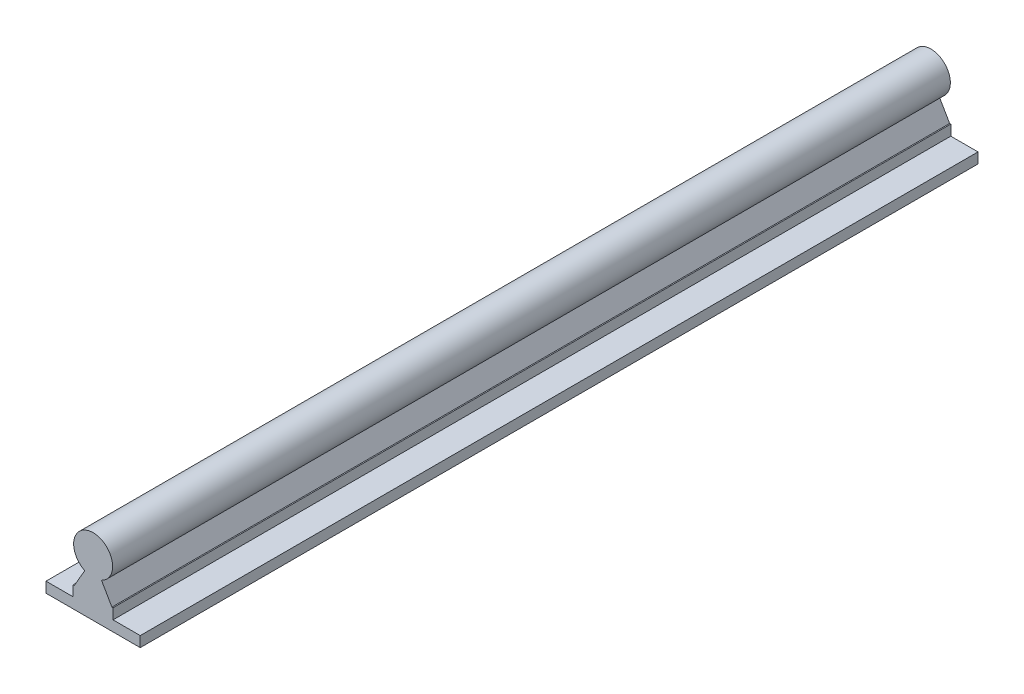
ISO-10303-21;
HEADER;
FILE_DESCRIPTION(('STEP AP214'),'2;1');
FILE_NAME('part.step','',(''),(''),'','','');
FILE_SCHEMA(('AUTOMOTIVE_DESIGN { 1 0 10303 214 1 1 1 1 }'));
ENDSEC;
DATA;
#1=APPLICATION_CONTEXT('core data for automotive mechanical design processes');
#2=APPLICATION_PROTOCOL_DEFINITION('international standard','automotive_design',2000,#1);
#3=PRODUCT_CONTEXT('',#1,'mechanical');
#4=PRODUCT('Part','Part','',(#3));
#5=PRODUCT_RELATED_PRODUCT_CATEGORY('part','',(#4));
#6=PRODUCT_DEFINITION_FORMATION('','',#4);
#7=PRODUCT_DEFINITION_CONTEXT('part definition',#1,'design');
#8=PRODUCT_DEFINITION('design','',#6,#7);
#9=PRODUCT_DEFINITION_SHAPE('','',#8);
#10=(LENGTH_UNIT() NAMED_UNIT(*) SI_UNIT(.MILLI.,.METRE.));
#11=(NAMED_UNIT(*) PLANE_ANGLE_UNIT() SI_UNIT($,.RADIAN.));
#12=(NAMED_UNIT(*) SI_UNIT($,.STERADIAN.) SOLID_ANGLE_UNIT());
#13=UNCERTAINTY_MEASURE_WITH_UNIT(LENGTH_MEASURE(1.E-05),#10,'distance_accuracy_value','');
#14=(GEOMETRIC_REPRESENTATION_CONTEXT(3) GLOBAL_UNCERTAINTY_ASSIGNED_CONTEXT((#13)) GLOBAL_UNIT_ASSIGNED_CONTEXT((#10,
#11,#12)) REPRESENTATION_CONTEXT('',''));
#15=CARTESIAN_POINT('',(0.,0.,0.));
#16=DIRECTION('',(0.,0.,1.));
#17=DIRECTION('',(1.,0.,0.));
#18=AXIS2_PLACEMENT_3D('',#15,#16,#17);
#19=CARTESIAN_POINT('',(-22.5,5.,400.));
#20=DIRECTION('',(1.,0.,0.));
#21=DIRECTION('',(0.,0.,-1.));
#22=AXIS2_PLACEMENT_3D('',#19,#20,#21);
#23=PLANE('',#22);
#24=DIRECTION('',(0.,-1.,0.));
#25=VECTOR('',#24,1.);
#26=CARTESIAN_POINT('',(-22.5,5.,0.));
#27=LINE('',#26,#25);
#28=CARTESIAN_POINT('',(-22.5,5.,0.));
#29=VERTEX_POINT('',#28);
#30=CARTESIAN_POINT('',(-22.5,0.,0.));
#31=VERTEX_POINT('',#30);
#32=EDGE_CURVE('E153',#29,#31,#27,.T.);
#33=ORIENTED_EDGE('',*,*,#32,.T.);
#34=DIRECTION('',(0.,0.,-1.));
#35=VECTOR('',#34,1.);
#36=CARTESIAN_POINT('',(-22.5,0.,400.));
#37=LINE('',#36,#35);
#38=CARTESIAN_POINT('',(-22.5,0.,400.));
#39=VERTEX_POINT('',#38);
#40=EDGE_CURVE('E11',#39,#31,#37,.T.);
#41=ORIENTED_EDGE('',*,*,#40,.F.);
#42=DIRECTION('',(0.,-1.,0.));
#43=VECTOR('',#42,1.);
#44=CARTESIAN_POINT('',(-22.5,5.,400.));
#45=LINE('',#44,#43);
#46=CARTESIAN_POINT('',(-22.5,5.,400.));
#47=VERTEX_POINT('',#46);
#48=EDGE_CURVE('E175',#47,#39,#45,.T.);
#49=ORIENTED_EDGE('',*,*,#48,.F.);
#50=DIRECTION('',(0.,0.,-1.));
#51=VECTOR('',#50,1.);
#52=CARTESIAN_POINT('',(-22.5,5.,400.));
#53=LINE('',#52,#51);
#54=EDGE_CURVE('E149',#47,#29,#53,.T.);
#55=ORIENTED_EDGE('',*,*,#54,.T.);
#56=EDGE_LOOP('',(#33,#41,#49,#55));
#57=FACE_BOUND('',#56,.T.);
#58=ADVANCED_FACE('F33',(#57),#23,.F.);
#59=CARTESIAN_POINT('',(-22.5,0.,400.));
#60=DIRECTION('',(0.,1.,0.));
#61=DIRECTION('',(0.,0.,1.));
#62=AXIS2_PLACEMENT_3D('',#59,#60,#61);
#63=PLANE('',#62);
#64=DIRECTION('',(1.,0.,0.));
#65=VECTOR('',#64,1.);
#66=CARTESIAN_POINT('',(-22.5,0.,0.));
#67=LINE('',#66,#65);
#68=CARTESIAN_POINT('',(22.5,0.,0.));
#69=VERTEX_POINT('',#68);
#70=EDGE_CURVE('E156',#31,#69,#67,.T.);
#71=ORIENTED_EDGE('',*,*,#70,.T.);
#72=DIRECTION('',(0.,0.,-1.));
#73=VECTOR('',#72,1.);
#74=CARTESIAN_POINT('',(22.5,0.,400.));
#75=LINE('',#74,#73);
#76=CARTESIAN_POINT('',(22.5,0.,400.));
#77=VERTEX_POINT('',#76);
#78=EDGE_CURVE('E41',#77,#69,#75,.T.);
#79=ORIENTED_EDGE('',*,*,#78,.F.);
#80=DIRECTION('',(1.,0.,0.));
#81=VECTOR('',#80,1.);
#82=CARTESIAN_POINT('',(-22.5,0.,400.));
#83=LINE('',#82,#81);
#84=EDGE_CURVE('E104',#39,#77,#83,.T.);
#85=ORIENTED_EDGE('',*,*,#84,.F.);
#86=ORIENTED_EDGE('',*,*,#40,.T.);
#87=EDGE_LOOP('',(#71,#79,#85,#86));
#88=FACE_BOUND('',#87,.T.);
#89=ADVANCED_FACE('F253',(#88),#63,.F.);
#90=CARTESIAN_POINT('',(22.5,0.,400.));
#91=DIRECTION('',(-1.,0.,0.));
#92=DIRECTION('',(0.,0.,1.));
#93=AXIS2_PLACEMENT_3D('',#90,#91,#92);
#94=PLANE('',#93);
#95=DIRECTION('',(0.,1.,0.));
#96=VECTOR('',#95,1.);
#97=CARTESIAN_POINT('',(22.5,0.,0.));
#98=LINE('',#97,#96);
#99=CARTESIAN_POINT('',(22.5,5.,0.));
#100=VERTEX_POINT('',#99);
#101=EDGE_CURVE('E158',#69,#100,#98,.T.);
#102=ORIENTED_EDGE('',*,*,#101,.T.);
#103=DIRECTION('',(0.,0.,-1.));
#104=VECTOR('',#103,1.);
#105=CARTESIAN_POINT('',(22.5,5.,400.));
#106=LINE('',#105,#104);
#107=CARTESIAN_POINT('',(22.5,5.,400.));
#108=VERTEX_POINT('',#107);
#109=EDGE_CURVE('E194',#108,#100,#106,.T.);
#110=ORIENTED_EDGE('',*,*,#109,.F.);
#111=DIRECTION('',(0.,1.,0.));
#112=VECTOR('',#111,1.);
#113=CARTESIAN_POINT('',(22.5,0.,400.));
#114=LINE('',#113,#112);
#115=EDGE_CURVE('E202',#77,#108,#114,.T.);
#116=ORIENTED_EDGE('',*,*,#115,.F.);
#117=ORIENTED_EDGE('',*,*,#78,.T.);
#118=EDGE_LOOP('',(#102,#110,#116,#117));
#119=FACE_BOUND('',#118,.T.);
#120=ADVANCED_FACE('F200',(#119),#94,.F.);
#121=CARTESIAN_POINT('',(22.5,5.,400.));
#122=DIRECTION('',(0.,-1.,0.));
#123=DIRECTION('',(1.,0.,0.));
#124=AXIS2_PLACEMENT_3D('',#121,#122,#123);
#125=PLANE('',#124);
#126=DIRECTION('',(-1.,0.,0.));
#127=VECTOR('',#126,1.);
#128=CARTESIAN_POINT('',(22.5,5.,0.));
#129=LINE('',#128,#127);
#130=CARTESIAN_POINT('',(9.5,4.99999999999999,0.));
#131=VERTEX_POINT('',#130);
#132=EDGE_CURVE('E160',#100,#131,#129,.T.);
#133=ORIENTED_EDGE('',*,*,#132,.T.);
#134=DIRECTION('',(0.,0.,-1.));
#135=VECTOR('',#134,1.);
#136=CARTESIAN_POINT('',(9.5,4.99999999999999,400.));
#137=LINE('',#136,#135);
#138=CARTESIAN_POINT('',(9.5,4.99999999999999,400.));
#139=VERTEX_POINT('',#138);
#140=EDGE_CURVE('E191',#139,#131,#137,.T.);
#141=ORIENTED_EDGE('',*,*,#140,.F.);
#142=DIRECTION('',(-1.,0.,0.));
#143=VECTOR('',#142,1.);
#144=CARTESIAN_POINT('',(22.5,5.,400.));
#145=LINE('',#144,#143);
#146=EDGE_CURVE('E220',#108,#139,#145,.T.);
#147=ORIENTED_EDGE('',*,*,#146,.F.);
#148=ORIENTED_EDGE('',*,*,#109,.T.);
#149=EDGE_LOOP('',(#133,#141,#147,#148));
#150=FACE_BOUND('',#149,.T.);
#151=ADVANCED_FACE('F211',(#150),#125,.F.);
#152=CARTESIAN_POINT('',(9.5,4.99999999999999,400.));
#153=DIRECTION('',(-1.,0.,0.));
#154=DIRECTION('',(0.,-1.,0.));
#155=AXIS2_PLACEMENT_3D('',#152,#153,#154);
#156=PLANE('',#155);
#157=DIRECTION('',(0.,1.,0.));
#158=VECTOR('',#157,1.);
#159=CARTESIAN_POINT('',(9.5,4.99999999999999,0.));
#160=LINE('',#159,#158);
#161=CARTESIAN_POINT('',(9.5,9.99999999999999,0.));
#162=VERTEX_POINT('',#161);
#163=EDGE_CURVE('E162',#131,#162,#160,.T.);
#164=ORIENTED_EDGE('',*,*,#163,.T.);
#165=DIRECTION('',(0.,0.,-1.));
#166=VECTOR('',#165,1.);
#167=CARTESIAN_POINT('',(9.5,9.99999999999999,400.));
#168=LINE('',#167,#166);
#169=CARTESIAN_POINT('',(9.5,9.99999999999999,400.));
#170=VERTEX_POINT('',#169);
#171=EDGE_CURVE('E188',#170,#162,#168,.T.);
#172=ORIENTED_EDGE('',*,*,#171,.F.);
#173=DIRECTION('',(0.,1.,0.));
#174=VECTOR('',#173,1.);
#175=CARTESIAN_POINT('',(9.5,4.99999999999999,400.));
#176=LINE('',#175,#174);
#177=EDGE_CURVE('E217',#139,#170,#176,.T.);
#178=ORIENTED_EDGE('',*,*,#177,.F.);
#179=ORIENTED_EDGE('',*,*,#140,.T.);
#180=EDGE_LOOP('',(#164,#172,#178,#179));
#181=FACE_BOUND('',#180,.T.);
#182=ADVANCED_FACE('F215',(#181),#156,.F.);
#183=CARTESIAN_POINT('',(9.5,9.99999999999999,400.));
#184=DIRECTION('',(0.,-1.,0.));
#185=DIRECTION('',(1.,0.,0.));
#186=AXIS2_PLACEMENT_3D('',#183,#184,#185);
#187=PLANE('',#186);
#188=DIRECTION('',(-1.,0.,0.));
#189=VECTOR('',#188,1.);
#190=CARTESIAN_POINT('',(9.5,9.99999999999999,0.));
#191=LINE('',#190,#189);
#192=CARTESIAN_POINT('',(8.967618538082,9.99999999999999,0.));
#193=VERTEX_POINT('',#192);
#194=EDGE_CURVE('E164',#162,#193,#191,.T.);
#195=ORIENTED_EDGE('',*,*,#194,.T.);
#196=DIRECTION('',(0.,0.,-1.));
#197=VECTOR('',#196,1.);
#198=CARTESIAN_POINT('',(8.967618538082,9.99999999999999,400.));
#199=LINE('',#198,#197);
#200=CARTESIAN_POINT('',(8.967618538082,9.99999999999999,400.));
#201=VERTEX_POINT('',#200);
#202=EDGE_CURVE('E185',#201,#193,#199,.T.);
#203=ORIENTED_EDGE('',*,*,#202,.F.);
#204=DIRECTION('',(-1.,0.,0.));
#205=VECTOR('',#204,1.);
#206=CARTESIAN_POINT('',(9.5,9.99999999999999,400.));
#207=LINE('',#206,#205);
#208=EDGE_CURVE('E219',#170,#201,#207,.T.);
#209=ORIENTED_EDGE('',*,*,#208,.F.);
#210=ORIENTED_EDGE('',*,*,#171,.T.);
#211=EDGE_LOOP('',(#195,#203,#209,#210));
#212=FACE_BOUND('',#211,.T.);
#213=ADVANCED_FACE('F266',(#212),#187,.F.);
#214=CARTESIAN_POINT('',(8.967618538082,9.99999999999999,400.));
#215=DIRECTION('',(-0.866025403784439,-0.5,0.));
#216=DIRECTION('',(0.5,-0.866025403784439,0.));
#217=AXIS2_PLACEMENT_3D('',#214,#215,#216);
#218=PLANE('',#217);
#219=DIRECTION('',(-0.5,0.866025403784439,0.));
#220=VECTOR('',#219,1.);
#221=CARTESIAN_POINT('',(8.967618538082,9.99999999999999,0.));
#222=LINE('',#221,#220);
#223=CARTESIAN_POINT('',(4.,18.6041677005791,0.));
#224=VERTEX_POINT('',#223);
#225=EDGE_CURVE('E166',#193,#224,#222,.T.);
#226=ORIENTED_EDGE('',*,*,#225,.T.);
#227=DIRECTION('',(0.,0.,-1.));
#228=VECTOR('',#227,1.);
#229=CARTESIAN_POINT('',(4.,18.6041677005791,400.));
#230=LINE('',#229,#228);
#231=CARTESIAN_POINT('',(4.,18.6041677005791,400.));
#232=VERTEX_POINT('',#231);
#233=EDGE_CURVE('E182',#232,#224,#230,.T.);
#234=ORIENTED_EDGE('',*,*,#233,.F.);
#235=DIRECTION('',(-0.5,0.866025403784439,0.));
#236=VECTOR('',#235,1.);
#237=CARTESIAN_POINT('',(8.967618538082,9.99999999999999,400.));
#238=LINE('',#237,#236);
#239=EDGE_CURVE('E222',#201,#232,#238,.T.);
#240=ORIENTED_EDGE('',*,*,#239,.F.);
#241=ORIENTED_EDGE('',*,*,#202,.T.);
#242=EDGE_LOOP('',(#226,#234,#240,#241));
#243=FACE_BOUND('',#242,.T.);
#244=ADVANCED_FACE('F269',(#243),#218,.F.);
#245=CARTESIAN_POINT('',(0.,27.,400.));
#246=DIRECTION('',(0.,0.,-1.));
#247=DIRECTION('',(-1.,0.,0.));
#248=AXIS2_PLACEMENT_3D('',#245,#246,#247);
#249=CYLINDRICAL_SURFACE('',#248,9.3);
#250=CARTESIAN_POINT('',(0.,27.,0.));
#251=DIRECTION('',(0.,0.,1.));
#252=DIRECTION('',(1.,0.,0.));
#253=AXIS2_PLACEMENT_3D('',#250,#251,#252);
#254=CIRCLE('',#253,9.3);
#255=CARTESIAN_POINT('',(-4.00000000000001,18.6041677005791,0.));
#256=VERTEX_POINT('',#255);
#257=EDGE_CURVE('E168',#224,#256,#254,.T.);
#258=ORIENTED_EDGE('',*,*,#257,.T.);
#259=DIRECTION('',(0.,0.,-1.));
#260=VECTOR('',#259,1.);
#261=CARTESIAN_POINT('',(-4.00000000000001,18.6041677005791,400.));
#262=LINE('',#261,#260);
#263=CARTESIAN_POINT('',(-4.00000000000001,18.6041677005791,400.));
#264=VERTEX_POINT('',#263);
#265=EDGE_CURVE('E179',#264,#256,#262,.T.);
#266=ORIENTED_EDGE('',*,*,#265,.F.);
#267=CARTESIAN_POINT('',(0.,27.,400.));
#268=DIRECTION('',(0.,0.,1.));
#269=DIRECTION('',(1.,0.,0.));
#270=AXIS2_PLACEMENT_3D('',#267,#268,#269);
#271=CIRCLE('',#270,9.3);
#272=EDGE_CURVE('E228',#232,#264,#271,.T.);
#273=ORIENTED_EDGE('',*,*,#272,.F.);
#274=ORIENTED_EDGE('',*,*,#233,.T.);
#275=EDGE_LOOP('',(#258,#266,#273,#274));
#276=FACE_BOUND('',#275,.T.);
#277=ADVANCED_FACE('F234',(#276),#249,.T.);
#278=CARTESIAN_POINT('',(-4.00000000000001,18.6041677005791,400.));
#279=DIRECTION('',(0.866025403784439,-0.5,0.));
#280=DIRECTION('',(0.5,0.866025403784439,0.));
#281=AXIS2_PLACEMENT_3D('',#278,#279,#280);
#282=PLANE('',#281);
#283=DIRECTION('',(-0.5,-0.866025403784439,0.));
#284=VECTOR('',#283,1.);
#285=CARTESIAN_POINT('',(-4.00000000000001,18.6041677005791,0.));
#286=LINE('',#285,#284);
#287=CARTESIAN_POINT('',(-8.96761853808201,10.,0.));
#288=VERTEX_POINT('',#287);
#289=EDGE_CURVE('E170',#256,#288,#286,.T.);
#290=ORIENTED_EDGE('',*,*,#289,.T.);
#291=DIRECTION('',(0.,0.,-1.));
#292=VECTOR('',#291,1.);
#293=CARTESIAN_POINT('',(-8.96761853808201,10.,400.));
#294=LINE('',#293,#292);
#295=CARTESIAN_POINT('',(-8.96761853808201,10.,400.));
#296=VERTEX_POINT('',#295);
#297=EDGE_CURVE('E144',#296,#288,#294,.T.);
#298=ORIENTED_EDGE('',*,*,#297,.F.);
#299=DIRECTION('',(-0.5,-0.866025403784439,0.));
#300=VECTOR('',#299,1.);
#301=CARTESIAN_POINT('',(-4.00000000000001,18.6041677005791,400.));
#302=LINE('',#301,#300);
#303=EDGE_CURVE('E135',#264,#296,#302,.T.);
#304=ORIENTED_EDGE('',*,*,#303,.F.);
#305=ORIENTED_EDGE('',*,*,#265,.T.);
#306=EDGE_LOOP('',(#290,#298,#304,#305));
#307=FACE_BOUND('',#306,.T.);
#308=ADVANCED_FACE('F238',(#307),#282,.F.);
#309=CARTESIAN_POINT('',(-8.96761853808201,10.,400.));
#310=DIRECTION('',(0.,-1.,0.));
#311=DIRECTION('',(0.,0.,-1.));
#312=AXIS2_PLACEMENT_3D('',#309,#310,#311);
#313=PLANE('',#312);
#314=DIRECTION('',(-1.,0.,0.));
#315=VECTOR('',#314,1.);
#316=CARTESIAN_POINT('',(-8.96761853808201,10.,0.));
#317=LINE('',#316,#315);
#318=CARTESIAN_POINT('',(-9.50000000000001,10.,0.));
#319=VERTEX_POINT('',#318);
#320=EDGE_CURVE('E143',#288,#319,#317,.T.);
#321=ORIENTED_EDGE('',*,*,#320,.T.);
#322=DIRECTION('',(0.,0.,-1.));
#323=VECTOR('',#322,1.);
#324=CARTESIAN_POINT('',(-9.50000000000001,10.,400.));
#325=LINE('',#324,#323);
#326=CARTESIAN_POINT('',(-9.50000000000001,10.,400.));
#327=VERTEX_POINT('',#326);
#328=EDGE_CURVE('E140',#327,#319,#325,.T.);
#329=ORIENTED_EDGE('',*,*,#328,.F.);
#330=DIRECTION('',(-1.,0.,0.));
#331=VECTOR('',#330,1.);
#332=CARTESIAN_POINT('',(-8.96761853808201,10.,400.));
#333=LINE('',#332,#331);
#334=EDGE_CURVE('E129',#296,#327,#333,.T.);
#335=ORIENTED_EDGE('',*,*,#334,.F.);
#336=ORIENTED_EDGE('',*,*,#297,.T.);
#337=EDGE_LOOP('',(#321,#329,#335,#336));
#338=FACE_BOUND('',#337,.T.);
#339=ADVANCED_FACE('F141',(#338),#313,.F.);
#340=CARTESIAN_POINT('',(-9.50000000000001,10.,400.));
#341=DIRECTION('',(1.,0.,0.));
#342=DIRECTION('',(0.,1.,0.));
#343=AXIS2_PLACEMENT_3D('',#340,#341,#342);
#344=PLANE('',#343);
#345=DIRECTION('',(0.,-1.,0.));
#346=VECTOR('',#345,1.);
#347=CARTESIAN_POINT('',(-9.50000000000001,10.,0.));
#348=LINE('',#347,#346);
#349=CARTESIAN_POINT('',(-9.5,5.,0.));
#350=VERTEX_POINT('',#349);
#351=EDGE_CURVE('E90',#319,#350,#348,.T.);
#352=ORIENTED_EDGE('',*,*,#351,.T.);
#353=DIRECTION('',(0.,0.,-1.));
#354=VECTOR('',#353,1.);
#355=CARTESIAN_POINT('',(-9.5,5.,400.));
#356=LINE('',#355,#354);
#357=CARTESIAN_POINT('',(-9.5,5.,400.));
#358=VERTEX_POINT('',#357);
#359=EDGE_CURVE('E145',#358,#350,#356,.T.);
#360=ORIENTED_EDGE('',*,*,#359,.F.);
#361=DIRECTION('',(0.,-1.,0.));
#362=VECTOR('',#361,1.);
#363=CARTESIAN_POINT('',(-9.50000000000001,10.,400.));
#364=LINE('',#363,#362);
#365=EDGE_CURVE('E133',#327,#358,#364,.T.);
#366=ORIENTED_EDGE('',*,*,#365,.F.);
#367=ORIENTED_EDGE('',*,*,#328,.T.);
#368=EDGE_LOOP('',(#352,#360,#366,#367));
#369=FACE_BOUND('',#368,.T.);
#370=ADVANCED_FACE('F147',(#369),#344,.F.);
#371=CARTESIAN_POINT('',(-9.5,5.,400.));
#372=DIRECTION('',(0.,-1.,0.));
#373=DIRECTION('',(1.,0.,0.));
#374=AXIS2_PLACEMENT_3D('',#371,#372,#373);
#375=PLANE('',#374);
#376=DIRECTION('',(-1.,0.,0.));
#377=VECTOR('',#376,1.);
#378=CARTESIAN_POINT('',(-9.5,5.,0.));
#379=LINE('',#378,#377);
#380=EDGE_CURVE('E96',#350,#29,#379,.T.);
#381=ORIENTED_EDGE('',*,*,#380,.T.);
#382=ORIENTED_EDGE('',*,*,#54,.F.);
#383=DIRECTION('',(-1.,0.,0.));
#384=VECTOR('',#383,1.);
#385=CARTESIAN_POINT('',(-9.5,5.,400.));
#386=LINE('',#385,#384);
#387=EDGE_CURVE('E49',#358,#47,#386,.T.);
#388=ORIENTED_EDGE('',*,*,#387,.F.);
#389=ORIENTED_EDGE('',*,*,#359,.T.);
#390=EDGE_LOOP('',(#381,#382,#388,#389));
#391=FACE_BOUND('',#390,.T.);
#392=ADVANCED_FACE('F242',(#391),#375,.F.);
#393=CARTESIAN_POINT('',(0.,27.,400.));
#394=DIRECTION('',(0.,0.,1.));
#395=DIRECTION('',(1.,0.,0.));
#396=AXIS2_PLACEMENT_3D('',#393,#394,#395);
#397=PLANE('',#396);
#398=ORIENTED_EDGE('',*,*,#48,.T.);
#399=ORIENTED_EDGE('',*,*,#84,.T.);
#400=ORIENTED_EDGE('',*,*,#115,.T.);
#401=ORIENTED_EDGE('',*,*,#146,.T.);
#402=ORIENTED_EDGE('',*,*,#177,.T.);
#403=ORIENTED_EDGE('',*,*,#208,.T.);
#404=ORIENTED_EDGE('',*,*,#239,.T.);
#405=ORIENTED_EDGE('',*,*,#272,.T.);
#406=ORIENTED_EDGE('',*,*,#303,.T.);
#407=ORIENTED_EDGE('',*,*,#334,.T.);
#408=ORIENTED_EDGE('',*,*,#365,.T.);
#409=ORIENTED_EDGE('',*,*,#387,.T.);
#410=EDGE_LOOP('',(#398,#399,#400,#401,#402,#403,#404,#405,#406,#407,#408,#409));
#411=FACE_BOUND('',#410,.T.);
#412=ADVANCED_FACE('F131',(#411),#397,.T.);
#413=CARTESIAN_POINT('',(0.,27.,0.));
#414=DIRECTION('',(0.,0.,1.));
#415=DIRECTION('',(1.,0.,0.));
#416=AXIS2_PLACEMENT_3D('',#413,#414,#415);
#417=PLANE('',#416);
#418=ORIENTED_EDGE('',*,*,#32,.F.);
#419=ORIENTED_EDGE('',*,*,#380,.F.);
#420=ORIENTED_EDGE('',*,*,#351,.F.);
#421=ORIENTED_EDGE('',*,*,#320,.F.);
#422=ORIENTED_EDGE('',*,*,#289,.F.);
#423=ORIENTED_EDGE('',*,*,#257,.F.);
#424=ORIENTED_EDGE('',*,*,#225,.F.);
#425=ORIENTED_EDGE('',*,*,#194,.F.);
#426=ORIENTED_EDGE('',*,*,#163,.F.);
#427=ORIENTED_EDGE('',*,*,#132,.F.);
#428=ORIENTED_EDGE('',*,*,#101,.F.);
#429=ORIENTED_EDGE('',*,*,#70,.F.);
#430=EDGE_LOOP('',(#418,#419,#420,#421,#422,#423,#424,#425,#426,#427,#428,#429));
#431=FACE_BOUND('',#430,.T.);
#432=ADVANCED_FACE('F206',(#431),#417,.F.);
#433=CLOSED_SHELL('',(#58,#89,#120,#151,#182,#213,#244,#277,#308,#339,#370,#392,#412,#432));
#434=MANIFOLD_SOLID_BREP('B2',#433);
#435=ADVANCED_BREP_SHAPE_REPRESENTATION('',(#18,#434),#14);
#436=SHAPE_DEFINITION_REPRESENTATION(#9,#435);
ENDSEC;
END-ISO-10303-21;
